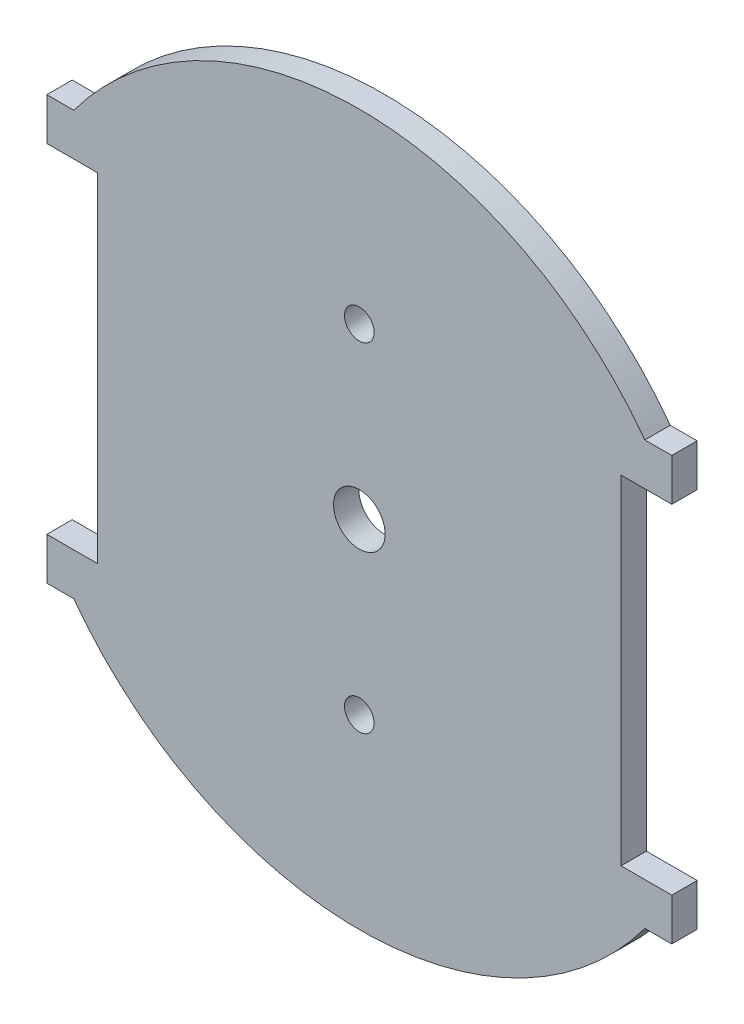
ISO-10303-21;
HEADER;
FILE_DESCRIPTION(('STEP AP214'),'2;1');
FILE_NAME('part.step','',(''),(''),'','','');
FILE_SCHEMA(('AUTOMOTIVE_DESIGN { 1 0 10303 214 1 1 1 1 }'));
ENDSEC;
DATA;
#1=APPLICATION_CONTEXT('core data for automotive mechanical design processes');
#2=APPLICATION_PROTOCOL_DEFINITION('international standard','automotive_design',2000,#1);
#3=PRODUCT_CONTEXT('',#1,'mechanical');
#4=PRODUCT('Part','Part','',(#3));
#5=PRODUCT_RELATED_PRODUCT_CATEGORY('part','',(#4));
#6=PRODUCT_DEFINITION_FORMATION('','',#4);
#7=PRODUCT_DEFINITION_CONTEXT('part definition',#1,'design');
#8=PRODUCT_DEFINITION('design','',#6,#7);
#9=PRODUCT_DEFINITION_SHAPE('','',#8);
#10=(LENGTH_UNIT() NAMED_UNIT(*) SI_UNIT(.MILLI.,.METRE.));
#11=(NAMED_UNIT(*) PLANE_ANGLE_UNIT() SI_UNIT($,.RADIAN.));
#12=(NAMED_UNIT(*) SI_UNIT($,.STERADIAN.) SOLID_ANGLE_UNIT());
#13=UNCERTAINTY_MEASURE_WITH_UNIT(LENGTH_MEASURE(1.E-05),#10,'distance_accuracy_value','');
#14=(GEOMETRIC_REPRESENTATION_CONTEXT(3) GLOBAL_UNCERTAINTY_ASSIGNED_CONTEXT((#13)) GLOBAL_UNIT_ASSIGNED_CONTEXT((#10,
#11,#12)) REPRESENTATION_CONTEXT('',''));
#15=CARTESIAN_POINT('',(0.,0.,0.));
#16=DIRECTION('',(0.,0.,1.));
#17=DIRECTION('',(1.,0.,0.));
#18=AXIS2_PLACEMENT_3D('',#15,#16,#17);
#19=CARTESIAN_POINT('',(0.,0.,3.));
#20=DIRECTION('',(0.,0.,1.));
#21=DIRECTION('',(1.,0.,0.));
#22=AXIS2_PLACEMENT_3D('',#19,#20,#21);
#23=PLANE('',#22);
#24=CARTESIAN_POINT('',(0.,20.,3.));
#25=DIRECTION('',(0.,0.,1.));
#26=DIRECTION('',(1.,0.,0.));
#27=AXIS2_PLACEMENT_3D('',#24,#25,#26);
#28=CIRCLE('',#27,1.75);
#29=CARTESIAN_POINT('',(1.75,20.,3.));
#30=VERTEX_POINT('',#29);
#31=EDGE_CURVE('E338',#30,#30,#28,.T.);
#32=ORIENTED_EDGE('',*,*,#31,.F.);
#33=EDGE_LOOP('',(#32));
#34=FACE_BOUND('',#33,.T.);
#35=DIRECTION('',(-1.,0.,0.));
#36=VECTOR('',#35,1.);
#37=CARTESIAN_POINT('',(-36.9323706252388,-20.,3.));
#38=LINE('',#37,#36);
#39=CARTESIAN_POINT('',(-30.9323706252388,-20.,3.));
#40=VERTEX_POINT('',#39);
#41=CARTESIAN_POINT('',(-36.9323706252388,-20.,3.));
#42=VERTEX_POINT('',#41);
#43=EDGE_CURVE('E208',#40,#42,#38,.T.);
#44=ORIENTED_EDGE('',*,*,#43,.T.);
#45=DIRECTION('',(0.,-1.,0.));
#46=VECTOR('',#45,1.);
#47=CARTESIAN_POINT('',(-36.9323706252388,-20.,3.));
#48=LINE('',#47,#46);
#49=CARTESIAN_POINT('',(-36.9323706252388,-25.,3.));
#50=VERTEX_POINT('',#49);
#51=EDGE_CURVE('E116',#42,#50,#48,.T.);
#52=ORIENTED_EDGE('',*,*,#51,.T.);
#53=DIRECTION('',(1.,0.,0.));
#54=VECTOR('',#53,1.);
#55=CARTESIAN_POINT('',(-36.9323706252388,-25.,3.));
#56=LINE('',#55,#54);
#57=CARTESIAN_POINT('',(-33.7490740613724,-25.,3.));
#58=VERTEX_POINT('',#57);
#59=EDGE_CURVE('E247',#50,#58,#56,.T.);
#60=ORIENTED_EDGE('',*,*,#59,.T.);
#61=CARTESIAN_POINT('',(0.,0.,3.));
#62=DIRECTION('',(0.,0.,1.));
#63=DIRECTION('',(1.,0.,0.));
#64=AXIS2_PLACEMENT_3D('',#61,#62,#63);
#65=CIRCLE('',#64,42.);
#66=CARTESIAN_POINT('',(33.7490740613724,-25.,3.));
#67=VERTEX_POINT('',#66);
#68=EDGE_CURVE('E266',#58,#67,#65,.T.);
#69=ORIENTED_EDGE('',*,*,#68,.T.);
#70=DIRECTION('',(1.,0.,0.));
#71=VECTOR('',#70,1.);
#72=CARTESIAN_POINT('',(36.9323706252388,-25.,3.));
#73=LINE('',#72,#71);
#74=CARTESIAN_POINT('',(36.9323706252388,-25.,3.));
#75=VERTEX_POINT('',#74);
#76=EDGE_CURVE('E263',#67,#75,#73,.T.);
#77=ORIENTED_EDGE('',*,*,#76,.T.);
#78=DIRECTION('',(0.,1.,0.));
#79=VECTOR('',#78,1.);
#80=CARTESIAN_POINT('',(36.9323706252388,-20.,3.));
#81=LINE('',#80,#79);
#82=CARTESIAN_POINT('',(36.9323706252388,-20.,3.));
#83=VERTEX_POINT('',#82);
#84=EDGE_CURVE('E265',#75,#83,#81,.T.);
#85=ORIENTED_EDGE('',*,*,#84,.T.);
#86=DIRECTION('',(-1.,0.,0.));
#87=VECTOR('',#86,1.);
#88=CARTESIAN_POINT('',(36.9323706252388,-20.,3.));
#89=LINE('',#88,#87);
#90=CARTESIAN_POINT('',(30.9323706252388,-20.,3.));
#91=VERTEX_POINT('',#90);
#92=EDGE_CURVE('E268',#83,#91,#89,.T.);
#93=ORIENTED_EDGE('',*,*,#92,.T.);
#94=DIRECTION('',(0.,1.,0.));
#95=VECTOR('',#94,1.);
#96=CARTESIAN_POINT('',(30.9323706252388,20.,3.));
#97=LINE('',#96,#95);
#98=CARTESIAN_POINT('',(30.9323706252388,20.,3.));
#99=VERTEX_POINT('',#98);
#100=EDGE_CURVE('E274',#91,#99,#97,.T.);
#101=ORIENTED_EDGE('',*,*,#100,.T.);
#102=DIRECTION('',(1.,0.,0.));
#103=VECTOR('',#102,1.);
#104=CARTESIAN_POINT('',(36.9323706252388,20.,3.));
#105=LINE('',#104,#103);
#106=CARTESIAN_POINT('',(36.9323706252388,20.,3.));
#107=VERTEX_POINT('',#106);
#108=EDGE_CURVE('E276',#99,#107,#105,.T.);
#109=ORIENTED_EDGE('',*,*,#108,.T.);
#110=DIRECTION('',(0.,1.,0.));
#111=VECTOR('',#110,1.);
#112=CARTESIAN_POINT('',(36.9323706252388,20.,3.));
#113=LINE('',#112,#111);
#114=CARTESIAN_POINT('',(36.9323706252388,25.,3.));
#115=VERTEX_POINT('',#114);
#116=EDGE_CURVE('E278',#107,#115,#113,.T.);
#117=ORIENTED_EDGE('',*,*,#116,.T.);
#118=DIRECTION('',(-1.,0.,0.));
#119=VECTOR('',#118,1.);
#120=CARTESIAN_POINT('',(36.9323706252388,25.,3.));
#121=LINE('',#120,#119);
#122=CARTESIAN_POINT('',(33.7490740613724,25.,3.));
#123=VERTEX_POINT('',#122);
#124=EDGE_CURVE('E280',#115,#123,#121,.T.);
#125=ORIENTED_EDGE('',*,*,#124,.T.);
#126=CARTESIAN_POINT('',(0.,0.,3.));
#127=DIRECTION('',(0.,0.,1.));
#128=DIRECTION('',(1.,0.,0.));
#129=AXIS2_PLACEMENT_3D('',#126,#127,#128);
#130=CIRCLE('',#129,42.);
#131=CARTESIAN_POINT('',(-33.7490740613724,25.,3.));
#132=VERTEX_POINT('',#131);
#133=EDGE_CURVE('E282',#123,#132,#130,.T.);
#134=ORIENTED_EDGE('',*,*,#133,.T.);
#135=DIRECTION('',(-1.,0.,0.));
#136=VECTOR('',#135,1.);
#137=CARTESIAN_POINT('',(-36.9323706252388,25.,3.));
#138=LINE('',#137,#136);
#139=CARTESIAN_POINT('',(-36.9323706252388,25.,3.));
#140=VERTEX_POINT('',#139);
#141=EDGE_CURVE('E159',#132,#140,#138,.T.);
#142=ORIENTED_EDGE('',*,*,#141,.T.);
#143=DIRECTION('',(0.,-1.,0.));
#144=VECTOR('',#143,1.);
#145=CARTESIAN_POINT('',(-36.9323706252388,20.,3.));
#146=LINE('',#145,#144);
#147=CARTESIAN_POINT('',(-36.9323706252388,20.,3.));
#148=VERTEX_POINT('',#147);
#149=EDGE_CURVE('E153',#140,#148,#146,.T.);
#150=ORIENTED_EDGE('',*,*,#149,.T.);
#151=DIRECTION('',(1.,0.,0.));
#152=VECTOR('',#151,1.);
#153=CARTESIAN_POINT('',(-36.9323706252388,20.,3.));
#154=LINE('',#153,#152);
#155=CARTESIAN_POINT('',(-30.9323706252388,20.,3.));
#156=VERTEX_POINT('',#155);
#157=EDGE_CURVE('E157',#148,#156,#154,.T.);
#158=ORIENTED_EDGE('',*,*,#157,.T.);
#159=DIRECTION('',(0.,-1.,0.));
#160=VECTOR('',#159,1.);
#161=CARTESIAN_POINT('',(-30.9323706252388,20.,3.));
#162=LINE('',#161,#160);
#163=EDGE_CURVE('E49',#156,#40,#162,.T.);
#164=ORIENTED_EDGE('',*,*,#163,.T.);
#165=EDGE_LOOP('',(#44,#52,#60,#69,#77,#85,#93,#101,#109,#117,#125,#134,#142,#150,#158,#164));
#166=FACE_BOUND('',#165,.T.);
#167=CARTESIAN_POINT('',(0.,0.,3.));
#168=DIRECTION('',(0.,0.,1.));
#169=DIRECTION('',(1.,0.,0.));
#170=AXIS2_PLACEMENT_3D('',#167,#168,#169);
#171=CIRCLE('',#170,3.05);
#172=CARTESIAN_POINT('',(3.05,0.,3.));
#173=VERTEX_POINT('',#172);
#174=EDGE_CURVE('E181',#173,#173,#171,.T.);
#175=ORIENTED_EDGE('',*,*,#174,.F.);
#176=EDGE_LOOP('',(#175));
#177=FACE_BOUND('',#176,.T.);
#178=CARTESIAN_POINT('',(0.,-20.,3.));
#179=DIRECTION('',(0.,0.,1.));
#180=DIRECTION('',(1.,0.,0.));
#181=AXIS2_PLACEMENT_3D('',#178,#179,#180);
#182=CIRCLE('',#181,1.75);
#183=CARTESIAN_POINT('',(1.75,-20.,3.));
#184=VERTEX_POINT('',#183);
#185=EDGE_CURVE('E329',#184,#184,#182,.T.);
#186=ORIENTED_EDGE('',*,*,#185,.F.);
#187=EDGE_LOOP('',(#186));
#188=FACE_BOUND('',#187,.T.);
#189=ADVANCED_FACE('F32',(#34,#166,#177,#188),#23,.T.);
#190=CARTESIAN_POINT('',(0.,0.,0.));
#191=DIRECTION('',(0.,0.,1.));
#192=DIRECTION('',(1.,0.,0.));
#193=AXIS2_PLACEMENT_3D('',#190,#191,#192);
#194=PLANE('',#193);
#195=CARTESIAN_POINT('',(0.,20.,0.));
#196=DIRECTION('',(0.,0.,1.));
#197=DIRECTION('',(1.,0.,0.));
#198=AXIS2_PLACEMENT_3D('',#195,#196,#197);
#199=CIRCLE('',#198,1.75);
#200=CARTESIAN_POINT('',(1.75,20.,0.));
#201=VERTEX_POINT('',#200);
#202=EDGE_CURVE('E335',#201,#201,#199,.T.);
#203=ORIENTED_EDGE('',*,*,#202,.T.);
#204=EDGE_LOOP('',(#203));
#205=FACE_BOUND('',#204,.T.);
#206=DIRECTION('',(-1.,0.,0.));
#207=VECTOR('',#206,1.);
#208=CARTESIAN_POINT('',(-36.9323706252388,-20.,0.));
#209=LINE('',#208,#207);
#210=CARTESIAN_POINT('',(-30.9323706252388,-20.,0.));
#211=VERTEX_POINT('',#210);
#212=CARTESIAN_POINT('',(-36.9323706252388,-20.,0.));
#213=VERTEX_POINT('',#212);
#214=EDGE_CURVE('E177',#211,#213,#209,.T.);
#215=ORIENTED_EDGE('',*,*,#214,.F.);
#216=DIRECTION('',(0.,-1.,0.));
#217=VECTOR('',#216,1.);
#218=CARTESIAN_POINT('',(-30.9323706252388,20.,0.));
#219=LINE('',#218,#217);
#220=CARTESIAN_POINT('',(-30.9323706252388,20.,0.));
#221=VERTEX_POINT('',#220);
#222=EDGE_CURVE('E108',#221,#211,#219,.T.);
#223=ORIENTED_EDGE('',*,*,#222,.F.);
#224=DIRECTION('',(1.,0.,0.));
#225=VECTOR('',#224,1.);
#226=CARTESIAN_POINT('',(-36.9323706252388,20.,0.));
#227=LINE('',#226,#225);
#228=CARTESIAN_POINT('',(-36.9323706252388,20.,0.));
#229=VERTEX_POINT('',#228);
#230=EDGE_CURVE('E102',#229,#221,#227,.T.);
#231=ORIENTED_EDGE('',*,*,#230,.F.);
#232=DIRECTION('',(0.,-1.,0.));
#233=VECTOR('',#232,1.);
#234=CARTESIAN_POINT('',(-36.9323706252388,20.,0.));
#235=LINE('',#234,#233);
#236=CARTESIAN_POINT('',(-36.9323706252388,25.,0.));
#237=VERTEX_POINT('',#236);
#238=EDGE_CURVE('E167',#237,#229,#235,.T.);
#239=ORIENTED_EDGE('',*,*,#238,.F.);
#240=DIRECTION('',(-1.,0.,0.));
#241=VECTOR('',#240,1.);
#242=CARTESIAN_POINT('',(-36.9323706252388,25.,0.));
#243=LINE('',#242,#241);
#244=CARTESIAN_POINT('',(-33.7490740613724,25.,0.));
#245=VERTEX_POINT('',#244);
#246=EDGE_CURVE('E203',#245,#237,#243,.T.);
#247=ORIENTED_EDGE('',*,*,#246,.F.);
#248=CARTESIAN_POINT('',(0.,0.,0.));
#249=DIRECTION('',(0.,0.,1.));
#250=DIRECTION('',(1.,0.,0.));
#251=AXIS2_PLACEMENT_3D('',#248,#249,#250);
#252=CIRCLE('',#251,42.);
#253=CARTESIAN_POINT('',(33.7490740613724,25.,0.));
#254=VERTEX_POINT('',#253);
#255=EDGE_CURVE('E201',#254,#245,#252,.T.);
#256=ORIENTED_EDGE('',*,*,#255,.F.);
#257=DIRECTION('',(-1.,0.,0.));
#258=VECTOR('',#257,1.);
#259=CARTESIAN_POINT('',(36.9323706252388,25.,0.));
#260=LINE('',#259,#258);
#261=CARTESIAN_POINT('',(36.9323706252388,25.,0.));
#262=VERTEX_POINT('',#261);
#263=EDGE_CURVE('E199',#262,#254,#260,.T.);
#264=ORIENTED_EDGE('',*,*,#263,.F.);
#265=DIRECTION('',(0.,1.,0.));
#266=VECTOR('',#265,1.);
#267=CARTESIAN_POINT('',(36.9323706252388,20.,0.));
#268=LINE('',#267,#266);
#269=CARTESIAN_POINT('',(36.9323706252388,20.,0.));
#270=VERTEX_POINT('',#269);
#271=EDGE_CURVE('E197',#270,#262,#268,.T.);
#272=ORIENTED_EDGE('',*,*,#271,.F.);
#273=DIRECTION('',(1.,0.,0.));
#274=VECTOR('',#273,1.);
#275=CARTESIAN_POINT('',(36.9323706252388,20.,0.));
#276=LINE('',#275,#274);
#277=CARTESIAN_POINT('',(30.9323706252388,20.,0.));
#278=VERTEX_POINT('',#277);
#279=EDGE_CURVE('E195',#278,#270,#276,.T.);
#280=ORIENTED_EDGE('',*,*,#279,.F.);
#281=DIRECTION('',(0.,1.,0.));
#282=VECTOR('',#281,1.);
#283=CARTESIAN_POINT('',(30.9323706252388,20.,0.));
#284=LINE('',#283,#282);
#285=CARTESIAN_POINT('',(30.9323706252388,-20.,0.));
#286=VERTEX_POINT('',#285);
#287=EDGE_CURVE('E193',#286,#278,#284,.T.);
#288=ORIENTED_EDGE('',*,*,#287,.F.);
#289=DIRECTION('',(-1.,0.,0.));
#290=VECTOR('',#289,1.);
#291=CARTESIAN_POINT('',(36.9323706252388,-20.,0.));
#292=LINE('',#291,#290);
#293=CARTESIAN_POINT('',(36.9323706252388,-20.,0.));
#294=VERTEX_POINT('',#293);
#295=EDGE_CURVE('E191',#294,#286,#292,.T.);
#296=ORIENTED_EDGE('',*,*,#295,.F.);
#297=DIRECTION('',(0.,1.,0.));
#298=VECTOR('',#297,1.);
#299=CARTESIAN_POINT('',(36.9323706252388,-20.,0.));
#300=LINE('',#299,#298);
#301=CARTESIAN_POINT('',(36.9323706252388,-25.,0.));
#302=VERTEX_POINT('',#301);
#303=EDGE_CURVE('E189',#302,#294,#300,.T.);
#304=ORIENTED_EDGE('',*,*,#303,.F.);
#305=DIRECTION('',(1.,0.,0.));
#306=VECTOR('',#305,1.);
#307=CARTESIAN_POINT('',(36.9323706252388,-25.,0.));
#308=LINE('',#307,#306);
#309=CARTESIAN_POINT('',(33.7490740613724,-25.,0.));
#310=VERTEX_POINT('',#309);
#311=EDGE_CURVE('E187',#310,#302,#308,.T.);
#312=ORIENTED_EDGE('',*,*,#311,.F.);
#313=CARTESIAN_POINT('',(0.,0.,0.));
#314=DIRECTION('',(0.,0.,1.));
#315=DIRECTION('',(1.,0.,0.));
#316=AXIS2_PLACEMENT_3D('',#313,#314,#315);
#317=CIRCLE('',#316,42.);
#318=CARTESIAN_POINT('',(-33.7490740613724,-25.,0.));
#319=VERTEX_POINT('',#318);
#320=EDGE_CURVE('E185',#319,#310,#317,.T.);
#321=ORIENTED_EDGE('',*,*,#320,.F.);
#322=DIRECTION('',(1.,0.,0.));
#323=VECTOR('',#322,1.);
#324=CARTESIAN_POINT('',(-36.9323706252388,-25.,0.));
#325=LINE('',#324,#323);
#326=CARTESIAN_POINT('',(-36.9323706252388,-25.,0.));
#327=VERTEX_POINT('',#326);
#328=EDGE_CURVE('E183',#327,#319,#325,.T.);
#329=ORIENTED_EDGE('',*,*,#328,.F.);
#330=DIRECTION('',(0.,-1.,0.));
#331=VECTOR('',#330,1.);
#332=CARTESIAN_POINT('',(-36.9323706252388,-20.,0.));
#333=LINE('',#332,#331);
#334=EDGE_CURVE('E180',#213,#327,#333,.T.);
#335=ORIENTED_EDGE('',*,*,#334,.F.);
#336=EDGE_LOOP('',(#215,#223,#231,#239,#247,#256,#264,#272,#280,#288,#296,#304,#312,#321,#329,#335));
#337=FACE_BOUND('',#336,.T.);
#338=CARTESIAN_POINT('',(0.,0.,0.));
#339=DIRECTION('',(0.,0.,1.));
#340=DIRECTION('',(1.,0.,0.));
#341=AXIS2_PLACEMENT_3D('',#338,#339,#340);
#342=CIRCLE('',#341,3.05);
#343=CARTESIAN_POINT('',(3.05,0.,0.));
#344=VERTEX_POINT('',#343);
#345=EDGE_CURVE('E341',#344,#344,#342,.T.);
#346=ORIENTED_EDGE('',*,*,#345,.T.);
#347=EDGE_LOOP('',(#346));
#348=FACE_BOUND('',#347,.T.);
#349=CARTESIAN_POINT('',(0.,-20.,0.));
#350=DIRECTION('',(0.,0.,1.));
#351=DIRECTION('',(1.,0.,0.));
#352=AXIS2_PLACEMENT_3D('',#349,#350,#351);
#353=CIRCLE('',#352,1.75);
#354=CARTESIAN_POINT('',(1.75,-20.,0.));
#355=VERTEX_POINT('',#354);
#356=EDGE_CURVE('E332',#355,#355,#353,.T.);
#357=ORIENTED_EDGE('',*,*,#356,.T.);
#358=EDGE_LOOP('',(#357));
#359=FACE_BOUND('',#358,.T.);
#360=ADVANCED_FACE('F251',(#205,#337,#348,#359),#194,.F.);
#361=CARTESIAN_POINT('',(-36.9323706252388,-20.,3.));
#362=DIRECTION('',(0.,-1.,0.));
#363=DIRECTION('',(1.,0.,0.));
#364=AXIS2_PLACEMENT_3D('',#361,#362,#363);
#365=PLANE('',#364);
#366=ORIENTED_EDGE('',*,*,#214,.T.);
#367=DIRECTION('',(0.,0.,-1.));
#368=VECTOR('',#367,1.);
#369=CARTESIAN_POINT('',(-36.9323706252388,-20.,3.));
#370=LINE('',#369,#368);
#371=EDGE_CURVE('E11',#42,#213,#370,.T.);
#372=ORIENTED_EDGE('',*,*,#371,.F.);
#373=ORIENTED_EDGE('',*,*,#43,.F.);
#374=DIRECTION('',(0.,0.,-1.));
#375=VECTOR('',#374,1.);
#376=CARTESIAN_POINT('',(-30.9323706252388,-20.,3.));
#377=LINE('',#376,#375);
#378=EDGE_CURVE('E173',#40,#211,#377,.T.);
#379=ORIENTED_EDGE('',*,*,#378,.T.);
#380=EDGE_LOOP('',(#366,#372,#373,#379));
#381=FACE_BOUND('',#380,.T.);
#382=ADVANCED_FACE('F34',(#381),#365,.F.);
#383=CARTESIAN_POINT('',(-36.9323706252388,-20.,3.));
#384=DIRECTION('',(1.,0.,0.));
#385=DIRECTION('',(0.,0.,-1.));
#386=AXIS2_PLACEMENT_3D('',#383,#384,#385);
#387=PLANE('',#386);
#388=ORIENTED_EDGE('',*,*,#334,.T.);
#389=DIRECTION('',(0.,0.,-1.));
#390=VECTOR('',#389,1.);
#391=CARTESIAN_POINT('',(-36.9323706252388,-25.,3.));
#392=LINE('',#391,#390);
#393=EDGE_CURVE('E41',#50,#327,#392,.T.);
#394=ORIENTED_EDGE('',*,*,#393,.F.);
#395=ORIENTED_EDGE('',*,*,#51,.F.);
#396=ORIENTED_EDGE('',*,*,#371,.T.);
#397=EDGE_LOOP('',(#388,#394,#395,#396));
#398=FACE_BOUND('',#397,.T.);
#399=ADVANCED_FACE('F482',(#398),#387,.F.);
#400=CARTESIAN_POINT('',(-36.9323706252388,-25.,3.));
#401=DIRECTION('',(0.,1.,0.));
#402=DIRECTION('',(0.,0.,1.));
#403=AXIS2_PLACEMENT_3D('',#400,#401,#402);
#404=PLANE('',#403);
#405=ORIENTED_EDGE('',*,*,#328,.T.);
#406=DIRECTION('',(0.,0.,-1.));
#407=VECTOR('',#406,1.);
#408=CARTESIAN_POINT('',(-33.7490740613724,-25.,3.));
#409=LINE('',#408,#407);
#410=EDGE_CURVE('E239',#58,#319,#409,.T.);
#411=ORIENTED_EDGE('',*,*,#410,.F.);
#412=ORIENTED_EDGE('',*,*,#59,.F.);
#413=ORIENTED_EDGE('',*,*,#393,.T.);
#414=EDGE_LOOP('',(#405,#411,#412,#413));
#415=FACE_BOUND('',#414,.T.);
#416=ADVANCED_FACE('F245',(#415),#404,.F.);
#417=CARTESIAN_POINT('',(0.,0.,3.));
#418=DIRECTION('',(0.,0.,-1.));
#419=DIRECTION('',(-1.,0.,0.));
#420=AXIS2_PLACEMENT_3D('',#417,#418,#419);
#421=CYLINDRICAL_SURFACE('',#420,42.);
#422=ORIENTED_EDGE('',*,*,#320,.T.);
#423=DIRECTION('',(0.,0.,-1.));
#424=VECTOR('',#423,1.);
#425=CARTESIAN_POINT('',(33.7490740613724,-25.,3.));
#426=LINE('',#425,#424);
#427=EDGE_CURVE('E236',#67,#310,#426,.T.);
#428=ORIENTED_EDGE('',*,*,#427,.F.);
#429=ORIENTED_EDGE('',*,*,#68,.F.);
#430=ORIENTED_EDGE('',*,*,#410,.T.);
#431=EDGE_LOOP('',(#422,#428,#429,#430));
#432=FACE_BOUND('',#431,.T.);
#433=ADVANCED_FACE('F257',(#432),#421,.T.);
#434=CARTESIAN_POINT('',(36.9323706252388,-25.,3.));
#435=DIRECTION('',(0.,1.,0.));
#436=DIRECTION('',(0.,0.,1.));
#437=AXIS2_PLACEMENT_3D('',#434,#435,#436);
#438=PLANE('',#437);
#439=ORIENTED_EDGE('',*,*,#311,.T.);
#440=DIRECTION('',(0.,0.,-1.));
#441=VECTOR('',#440,1.);
#442=CARTESIAN_POINT('',(36.9323706252388,-25.,3.));
#443=LINE('',#442,#441);
#444=EDGE_CURVE('E233',#75,#302,#443,.T.);
#445=ORIENTED_EDGE('',*,*,#444,.F.);
#446=ORIENTED_EDGE('',*,*,#76,.F.);
#447=ORIENTED_EDGE('',*,*,#427,.T.);
#448=EDGE_LOOP('',(#439,#445,#446,#447));
#449=FACE_BOUND('',#448,.T.);
#450=ADVANCED_FACE('F261',(#449),#438,.F.);
#451=CARTESIAN_POINT('',(36.9323706252388,-20.,3.));
#452=DIRECTION('',(-1.,0.,0.));
#453=DIRECTION('',(0.,0.,1.));
#454=AXIS2_PLACEMENT_3D('',#451,#452,#453);
#455=PLANE('',#454);
#456=ORIENTED_EDGE('',*,*,#303,.T.);
#457=DIRECTION('',(0.,0.,-1.));
#458=VECTOR('',#457,1.);
#459=CARTESIAN_POINT('',(36.9323706252388,-20.,3.));
#460=LINE('',#459,#458);
#461=EDGE_CURVE('E230',#83,#294,#460,.T.);
#462=ORIENTED_EDGE('',*,*,#461,.F.);
#463=ORIENTED_EDGE('',*,*,#84,.F.);
#464=ORIENTED_EDGE('',*,*,#444,.T.);
#465=EDGE_LOOP('',(#456,#462,#463,#464));
#466=FACE_BOUND('',#465,.T.);
#467=ADVANCED_FACE('F447',(#466),#455,.F.);
#468=CARTESIAN_POINT('',(36.9323706252388,-20.,3.));
#469=DIRECTION('',(0.,-1.,0.));
#470=DIRECTION('',(0.,0.,-1.));
#471=AXIS2_PLACEMENT_3D('',#468,#469,#470);
#472=PLANE('',#471);
#473=ORIENTED_EDGE('',*,*,#295,.T.);
#474=DIRECTION('',(0.,0.,-1.));
#475=VECTOR('',#474,1.);
#476=CARTESIAN_POINT('',(30.9323706252388,-20.,3.));
#477=LINE('',#476,#475);
#478=EDGE_CURVE('E227',#91,#286,#477,.T.);
#479=ORIENTED_EDGE('',*,*,#478,.F.);
#480=ORIENTED_EDGE('',*,*,#92,.F.);
#481=ORIENTED_EDGE('',*,*,#461,.T.);
#482=EDGE_LOOP('',(#473,#479,#480,#481));
#483=FACE_BOUND('',#482,.T.);
#484=ADVANCED_FACE('F437',(#483),#472,.F.);
#485=CARTESIAN_POINT('',(30.9323706252388,20.,3.));
#486=DIRECTION('',(-1.,0.,0.));
#487=DIRECTION('',(0.,-1.,0.));
#488=AXIS2_PLACEMENT_3D('',#485,#486,#487);
#489=PLANE('',#488);
#490=ORIENTED_EDGE('',*,*,#287,.T.);
#491=DIRECTION('',(0.,0.,-1.));
#492=VECTOR('',#491,1.);
#493=CARTESIAN_POINT('',(30.9323706252388,20.,3.));
#494=LINE('',#493,#492);
#495=EDGE_CURVE('E224',#99,#278,#494,.T.);
#496=ORIENTED_EDGE('',*,*,#495,.F.);
#497=ORIENTED_EDGE('',*,*,#100,.F.);
#498=ORIENTED_EDGE('',*,*,#478,.T.);
#499=EDGE_LOOP('',(#490,#496,#497,#498));
#500=FACE_BOUND('',#499,.T.);
#501=ADVANCED_FACE('F427',(#500),#489,.F.);
#502=CARTESIAN_POINT('',(36.9323706252388,20.,3.));
#503=DIRECTION('',(0.,1.,0.));
#504=DIRECTION('',(-1.,0.,0.));
#505=AXIS2_PLACEMENT_3D('',#502,#503,#504);
#506=PLANE('',#505);
#507=ORIENTED_EDGE('',*,*,#279,.T.);
#508=DIRECTION('',(0.,0.,-1.));
#509=VECTOR('',#508,1.);
#510=CARTESIAN_POINT('',(36.9323706252388,20.,3.));
#511=LINE('',#510,#509);
#512=EDGE_CURVE('E221',#107,#270,#511,.T.);
#513=ORIENTED_EDGE('',*,*,#512,.F.);
#514=ORIENTED_EDGE('',*,*,#108,.F.);
#515=ORIENTED_EDGE('',*,*,#495,.T.);
#516=EDGE_LOOP('',(#507,#513,#514,#515));
#517=FACE_BOUND('',#516,.T.);
#518=ADVANCED_FACE('F417',(#517),#506,.F.);
#519=CARTESIAN_POINT('',(36.9323706252388,20.,3.));
#520=DIRECTION('',(-1.,0.,0.));
#521=DIRECTION('',(0.,0.,1.));
#522=AXIS2_PLACEMENT_3D('',#519,#520,#521);
#523=PLANE('',#522);
#524=ORIENTED_EDGE('',*,*,#271,.T.);
#525=DIRECTION('',(0.,0.,-1.));
#526=VECTOR('',#525,1.);
#527=CARTESIAN_POINT('',(36.9323706252388,25.,3.));
#528=LINE('',#527,#526);
#529=EDGE_CURVE('E218',#115,#262,#528,.T.);
#530=ORIENTED_EDGE('',*,*,#529,.F.);
#531=ORIENTED_EDGE('',*,*,#116,.F.);
#532=ORIENTED_EDGE('',*,*,#512,.T.);
#533=EDGE_LOOP('',(#524,#530,#531,#532));
#534=FACE_BOUND('',#533,.T.);
#535=ADVANCED_FACE('F407',(#534),#523,.F.);
#536=CARTESIAN_POINT('',(36.9323706252388,25.,3.));
#537=DIRECTION('',(0.,-1.,0.));
#538=DIRECTION('',(0.,0.,-1.));
#539=AXIS2_PLACEMENT_3D('',#536,#537,#538);
#540=PLANE('',#539);
#541=ORIENTED_EDGE('',*,*,#263,.T.);
#542=DIRECTION('',(0.,0.,-1.));
#543=VECTOR('',#542,1.);
#544=CARTESIAN_POINT('',(33.7490740613724,25.,3.));
#545=LINE('',#544,#543);
#546=EDGE_CURVE('E215',#123,#254,#545,.T.);
#547=ORIENTED_EDGE('',*,*,#546,.F.);
#548=ORIENTED_EDGE('',*,*,#124,.F.);
#549=ORIENTED_EDGE('',*,*,#529,.T.);
#550=EDGE_LOOP('',(#541,#547,#548,#549));
#551=FACE_BOUND('',#550,.T.);
#552=ADVANCED_FACE('F398',(#551),#540,.F.);
#553=CARTESIAN_POINT('',(0.,0.,3.));
#554=DIRECTION('',(0.,0.,-1.));
#555=DIRECTION('',(-1.,0.,0.));
#556=AXIS2_PLACEMENT_3D('',#553,#554,#555);
#557=CYLINDRICAL_SURFACE('',#556,42.);
#558=ORIENTED_EDGE('',*,*,#255,.T.);
#559=DIRECTION('',(0.,0.,-1.));
#560=VECTOR('',#559,1.);
#561=CARTESIAN_POINT('',(-33.7490740613724,25.,3.));
#562=LINE('',#561,#560);
#563=EDGE_CURVE('E212',#132,#245,#562,.T.);
#564=ORIENTED_EDGE('',*,*,#563,.F.);
#565=ORIENTED_EDGE('',*,*,#133,.F.);
#566=ORIENTED_EDGE('',*,*,#546,.T.);
#567=EDGE_LOOP('',(#558,#564,#565,#566));
#568=FACE_BOUND('',#567,.T.);
#569=ADVANCED_FACE('F288',(#568),#557,.T.);
#570=CARTESIAN_POINT('',(-36.9323706252388,25.,3.));
#571=DIRECTION('',(0.,-1.,0.));
#572=DIRECTION('',(0.,0.,-1.));
#573=AXIS2_PLACEMENT_3D('',#570,#571,#572);
#574=PLANE('',#573);
#575=ORIENTED_EDGE('',*,*,#246,.T.);
#576=DIRECTION('',(0.,0.,-1.));
#577=VECTOR('',#576,1.);
#578=CARTESIAN_POINT('',(-36.9323706252388,25.,3.));
#579=LINE('',#578,#577);
#580=EDGE_CURVE('E168',#140,#237,#579,.T.);
#581=ORIENTED_EDGE('',*,*,#580,.F.);
#582=ORIENTED_EDGE('',*,*,#141,.F.);
#583=ORIENTED_EDGE('',*,*,#563,.T.);
#584=EDGE_LOOP('',(#575,#581,#582,#583));
#585=FACE_BOUND('',#584,.T.);
#586=ADVANCED_FACE('F292',(#585),#574,.F.);
#587=CARTESIAN_POINT('',(-36.9323706252388,20.,3.));
#588=DIRECTION('',(1.,0.,0.));
#589=DIRECTION('',(0.,0.,-1.));
#590=AXIS2_PLACEMENT_3D('',#587,#588,#589);
#591=PLANE('',#590);
#592=ORIENTED_EDGE('',*,*,#238,.T.);
#593=DIRECTION('',(0.,0.,-1.));
#594=VECTOR('',#593,1.);
#595=CARTESIAN_POINT('',(-36.9323706252388,20.,3.));
#596=LINE('',#595,#594);
#597=EDGE_CURVE('E164',#148,#229,#596,.T.);
#598=ORIENTED_EDGE('',*,*,#597,.F.);
#599=ORIENTED_EDGE('',*,*,#149,.F.);
#600=ORIENTED_EDGE('',*,*,#580,.T.);
#601=EDGE_LOOP('',(#592,#598,#599,#600));
#602=FACE_BOUND('',#601,.T.);
#603=ADVANCED_FACE('F165',(#602),#591,.F.);
#604=CARTESIAN_POINT('',(-36.9323706252388,20.,3.));
#605=DIRECTION('',(0.,1.,0.));
#606=DIRECTION('',(0.,0.,1.));
#607=AXIS2_PLACEMENT_3D('',#604,#605,#606);
#608=PLANE('',#607);
#609=ORIENTED_EDGE('',*,*,#230,.T.);
#610=DIRECTION('',(0.,0.,-1.));
#611=VECTOR('',#610,1.);
#612=CARTESIAN_POINT('',(-30.9323706252388,20.,3.));
#613=LINE('',#612,#611);
#614=EDGE_CURVE('E169',#156,#221,#613,.T.);
#615=ORIENTED_EDGE('',*,*,#614,.F.);
#616=ORIENTED_EDGE('',*,*,#157,.F.);
#617=ORIENTED_EDGE('',*,*,#597,.T.);
#618=EDGE_LOOP('',(#609,#615,#616,#617));
#619=FACE_BOUND('',#618,.T.);
#620=ADVANCED_FACE('F171',(#619),#608,.F.);
#621=CARTESIAN_POINT('',(-30.9323706252388,20.,3.));
#622=DIRECTION('',(1.,0.,0.));
#623=DIRECTION('',(0.,1.,0.));
#624=AXIS2_PLACEMENT_3D('',#621,#622,#623);
#625=PLANE('',#624);
#626=ORIENTED_EDGE('',*,*,#222,.T.);
#627=ORIENTED_EDGE('',*,*,#378,.F.);
#628=ORIENTED_EDGE('',*,*,#163,.F.);
#629=ORIENTED_EDGE('',*,*,#614,.T.);
#630=EDGE_LOOP('',(#626,#627,#628,#629));
#631=FACE_BOUND('',#630,.T.);
#632=ADVANCED_FACE('F296',(#631),#625,.F.);
#633=CARTESIAN_POINT('',(0.,0.,3.));
#634=DIRECTION('',(0.,0.,-1.));
#635=DIRECTION('',(-1.,0.,0.));
#636=AXIS2_PLACEMENT_3D('',#633,#634,#635);
#637=CYLINDRICAL_SURFACE('',#636,3.05);
#638=ORIENTED_EDGE('',*,*,#174,.T.);
#639=EDGE_LOOP('',(#638));
#640=FACE_BOUND('',#639,.T.);
#641=ORIENTED_EDGE('',*,*,#345,.F.);
#642=EDGE_LOOP('',(#641));
#643=FACE_BOUND('',#642,.T.);
#644=ADVANCED_FACE('F298',(#640,#643),#637,.F.);
#645=CARTESIAN_POINT('',(0.,20.,3.));
#646=DIRECTION('',(0.,0.,-1.));
#647=DIRECTION('',(-1.,0.,0.));
#648=AXIS2_PLACEMENT_3D('',#645,#646,#647);
#649=CYLINDRICAL_SURFACE('',#648,1.75);
#650=ORIENTED_EDGE('',*,*,#31,.T.);
#651=EDGE_LOOP('',(#650));
#652=FACE_BOUND('',#651,.T.);
#653=ORIENTED_EDGE('',*,*,#202,.F.);
#654=EDGE_LOOP('',(#653));
#655=FACE_BOUND('',#654,.T.);
#656=ADVANCED_FACE('F304',(#652,#655),#649,.F.);
#657=CARTESIAN_POINT('',(0.,-20.,3.));
#658=DIRECTION('',(0.,0.,-1.));
#659=DIRECTION('',(-1.,0.,0.));
#660=AXIS2_PLACEMENT_3D('',#657,#658,#659);
#661=CYLINDRICAL_SURFACE('',#660,1.75);
#662=ORIENTED_EDGE('',*,*,#185,.T.);
#663=EDGE_LOOP('',(#662));
#664=FACE_BOUND('',#663,.T.);
#665=ORIENTED_EDGE('',*,*,#356,.F.);
#666=EDGE_LOOP('',(#665));
#667=FACE_BOUND('',#666,.T.);
#668=ADVANCED_FACE('F320',(#664,#667),#661,.F.);
#669=CLOSED_SHELL('',(#189,#360,#382,#399,#416,#433,#450,#467,#484,#501,#518,#535,#552,#569,
#586,#603,#620,#632,#644,#656,#668));
#670=MANIFOLD_SOLID_BREP('B2',#669);
#671=ADVANCED_BREP_SHAPE_REPRESENTATION('',(#18,#670),#14);
#672=SHAPE_DEFINITION_REPRESENTATION(#9,#671);
ENDSEC;
END-ISO-10303-21;
